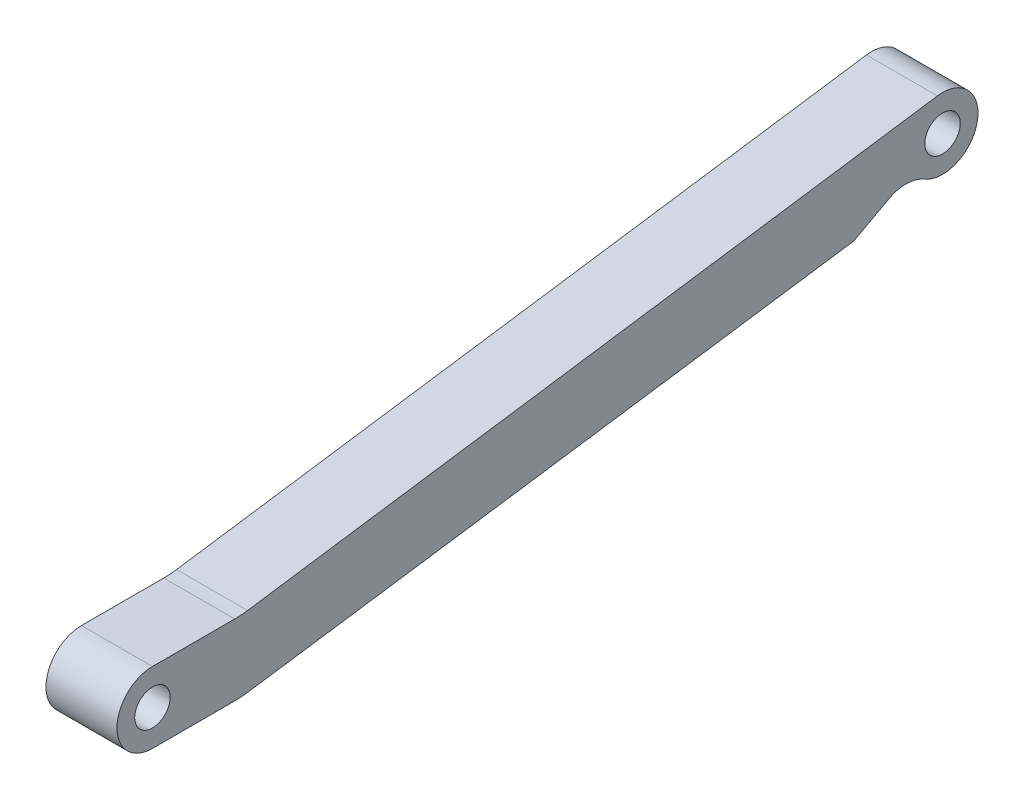
ISO-10303-21;
HEADER;
FILE_DESCRIPTION(('STEP AP214'),'2;1');
FILE_NAME('part.step','',(''),(''),'','','');
FILE_SCHEMA(('AUTOMOTIVE_DESIGN { 1 0 10303 214 1 1 1 1 }'));
ENDSEC;
DATA;
#1=APPLICATION_CONTEXT('core data for automotive mechanical design processes');
#2=APPLICATION_PROTOCOL_DEFINITION('international standard','automotive_design',2000,#1);
#3=PRODUCT_CONTEXT('',#1,'mechanical');
#4=PRODUCT('Part','Part','',(#3));
#5=PRODUCT_RELATED_PRODUCT_CATEGORY('part','',(#4));
#6=PRODUCT_DEFINITION_FORMATION('','',#4);
#7=PRODUCT_DEFINITION_CONTEXT('part definition',#1,'design');
#8=PRODUCT_DEFINITION('design','',#6,#7);
#9=PRODUCT_DEFINITION_SHAPE('','',#8);
#10=(LENGTH_UNIT() NAMED_UNIT(*) SI_UNIT(.MILLI.,.METRE.));
#11=(NAMED_UNIT(*) PLANE_ANGLE_UNIT() SI_UNIT($,.RADIAN.));
#12=(NAMED_UNIT(*) SI_UNIT($,.STERADIAN.) SOLID_ANGLE_UNIT());
#13=UNCERTAINTY_MEASURE_WITH_UNIT(LENGTH_MEASURE(1.E-05),#10,'distance_accuracy_value','');
#14=(GEOMETRIC_REPRESENTATION_CONTEXT(3) GLOBAL_UNCERTAINTY_ASSIGNED_CONTEXT((#13)) GLOBAL_UNIT_ASSIGNED_CONTEXT((#10,
#11,#12)) REPRESENTATION_CONTEXT('',''));
#15=CARTESIAN_POINT('',(0.,0.,0.));
#16=DIRECTION('',(0.,0.,1.));
#17=DIRECTION('',(1.,0.,0.));
#18=AXIS2_PLACEMENT_3D('',#15,#16,#17);
#19=CARTESIAN_POINT('',(-2.,-1.68281133077112,-42.4742149862689));
#20=DIRECTION('',(1.,0.,0.));
#21=DIRECTION('',(0.,0.,-1.));
#22=AXIS2_PLACEMENT_3D('',#19,#20,#21);
#23=CYLINDRICAL_SURFACE('',#22,2.);
#24=DIRECTION('',(1.,0.,0.));
#25=VECTOR('',#24,1.);
#26=CARTESIAN_POINT('',(-2.,0.0335943346144431,-43.5008364315117));
#27=LINE('',#26,#25);
#28=CARTESIAN_POINT('',(-2.,0.0335943346144431,-43.5008364315117));
#29=VERTEX_POINT('',#28);
#30=CARTESIAN_POINT('',(2.,0.0335943346144431,-43.5008364315117));
#31=VERTEX_POINT('',#30);
#32=EDGE_CURVE('E41',#29,#31,#27,.T.);
#33=ORIENTED_EDGE('',*,*,#32,.T.);
#34=CARTESIAN_POINT('',(2.,-1.68281133077112,-42.4742149862689));
#35=DIRECTION('',(1.,0.,0.));
#36=DIRECTION('',(0.,0.,-1.));
#37=AXIS2_PLACEMENT_3D('',#34,#35,#36);
#38=CIRCLE('',#37,2.);
#39=CARTESIAN_POINT('',(2.,0.0790195647686724,-41.5276676311295));
#40=VERTEX_POINT('',#39);
#41=EDGE_CURVE('E118',#31,#40,#38,.T.);
#42=ORIENTED_EDGE('',*,*,#41,.T.);
#43=DIRECTION('',(1.,0.,0.));
#44=VECTOR('',#43,1.);
#45=CARTESIAN_POINT('',(-2.,0.0790195647686724,-41.5276676311295));
#46=LINE('',#45,#44);
#47=CARTESIAN_POINT('',(-2.,0.0790195647686724,-41.5276676311295));
#48=VERTEX_POINT('',#47);
#49=EDGE_CURVE('E11',#48,#40,#46,.T.);
#50=ORIENTED_EDGE('',*,*,#49,.F.);
#51=CARTESIAN_POINT('',(-2.,-1.68281133077112,-42.4742149862689));
#52=DIRECTION('',(1.,0.,0.));
#53=DIRECTION('',(0.,0.,-1.));
#54=AXIS2_PLACEMENT_3D('',#51,#52,#53);
#55=CIRCLE('',#54,2.);
#56=EDGE_CURVE('E54',#29,#48,#55,.T.);
#57=ORIENTED_EDGE('',*,*,#56,.F.);
#58=EDGE_LOOP('',(#33,#42,#50,#57));
#59=FACE_BOUND('',#58,.T.);
#60=ADVANCED_FACE('F38',(#59),#23,.F.);
#61=CARTESIAN_POINT('',(-2.,-17.2521497769474,-9.26875376245219));
#62=DIRECTION('',(0.,-0.880915447769895,-0.473273677569718));
#63=DIRECTION('',(0.,0.473273677569718,-0.880915447769895));
#64=AXIS2_PLACEMENT_3D('',#61,#62,#63);
#65=PLANE('',#64);
#66=ORIENTED_EDGE('',*,*,#49,.T.);
#67=DIRECTION('',(0.,0.473273677569718,-0.880915447769895));
#68=VECTOR('',#67,1.);
#69=CARTESIAN_POINT('',(2.,-17.2521497769474,-9.26875376245219));
#70=LINE('',#69,#68);
#71=CARTESIAN_POINT('',(2.,-0.995597333777485,-39.5274578767545));
#72=VERTEX_POINT('',#71);
#73=EDGE_CURVE('E136',#72,#40,#70,.T.);
#74=ORIENTED_EDGE('',*,*,#73,.F.);
#75=DIRECTION('',(1.,0.,0.));
#76=VECTOR('',#75,1.);
#77=CARTESIAN_POINT('',(-2.,-0.995597333777485,-39.5274578767545));
#78=LINE('',#77,#76);
#79=CARTESIAN_POINT('',(-2.,-0.995597333777485,-39.5274578767545));
#80=VERTEX_POINT('',#79);
#81=EDGE_CURVE('E46',#80,#72,#78,.T.);
#82=ORIENTED_EDGE('',*,*,#81,.F.);
#83=DIRECTION('',(0.,0.473273677569718,-0.880915447769895));
#84=VECTOR('',#83,1.);
#85=CARTESIAN_POINT('',(-2.,-17.2521497769474,-9.26875376245219));
#86=LINE('',#85,#84);
#87=EDGE_CURVE('E184',#80,#48,#86,.T.);
#88=ORIENTED_EDGE('',*,*,#87,.T.);
#89=EDGE_LOOP('',(#66,#74,#82,#88));
#90=FACE_BOUND('',#89,.T.);
#91=ADVANCED_FACE('F233',(#90),#65,.T.);
#92=CARTESIAN_POINT('',(-2.,-6.58633622576093,-0.954622222304602));
#93=DIRECTION('',(0.,-0.989658876840346,-0.143440954720416));
#94=DIRECTION('',(0.,0.143440954720416,-0.989658876840346));
#95=AXIS2_PLACEMENT_3D('',#92,#93,#94);
#96=PLANE('',#95);
#97=ORIENTED_EDGE('',*,*,#81,.T.);
#98=DIRECTION('',(0.,0.143440954720416,-0.989658876840346));
#99=VECTOR('',#98,1.);
#100=CARTESIAN_POINT('',(2.,-6.58633622576093,-0.954622222304602));
#101=LINE('',#100,#99);
#102=CARTESIAN_POINT('',(2.,-5.94829438420173,-5.35673857411912));
#103=VERTEX_POINT('',#102);
#104=EDGE_CURVE('E155',#103,#72,#101,.T.);
#105=ORIENTED_EDGE('',*,*,#104,.F.);
#106=DIRECTION('',(1.,0.,0.));
#107=VECTOR('',#106,1.);
#108=CARTESIAN_POINT('',(-2.,-5.94829438420173,-5.35673857411912));
#109=LINE('',#108,#107);
#110=CARTESIAN_POINT('',(-2.,-5.94829438420173,-5.35673857411912));
#111=VERTEX_POINT('',#110);
#112=EDGE_CURVE('E192',#111,#103,#109,.T.);
#113=ORIENTED_EDGE('',*,*,#112,.F.);
#114=DIRECTION('',(0.,0.143440954720416,-0.989658876840346));
#115=VECTOR('',#114,1.);
#116=CARTESIAN_POINT('',(-2.,-6.58633622576093,-0.954622222304602));
#117=LINE('',#116,#115);
#118=EDGE_CURVE('E182',#111,#80,#117,.T.);
#119=ORIENTED_EDGE('',*,*,#118,.T.);
#120=EDGE_LOOP('',(#97,#105,#113,#119));
#121=FACE_BOUND('',#120,.T.);
#122=ADVANCED_FACE('F231',(#121),#96,.T.);
#123=CARTESIAN_POINT('',(-2.,-1.,-4.63953380051704));
#124=DIRECTION('',(1.,0.,0.));
#125=DIRECTION('',(0.,0.,-1.));
#126=AXIS2_PLACEMENT_3D('',#123,#124,#125);
#127=CYLINDRICAL_SURFACE('',#126,5.);
#128=ORIENTED_EDGE('',*,*,#112,.T.);
#129=CARTESIAN_POINT('',(2.,-1.,-4.63953380051704));
#130=DIRECTION('',(1.,0.,0.));
#131=DIRECTION('',(0.,0.,-1.));
#132=AXIS2_PLACEMENT_3D('',#129,#130,#131);
#133=CIRCLE('',#132,5.);
#134=CARTESIAN_POINT('',(2.,-6.,-4.63953380051704));
#135=VERTEX_POINT('',#134);
#136=EDGE_CURVE('E152',#135,#103,#133,.T.);
#137=ORIENTED_EDGE('',*,*,#136,.F.);
#138=DIRECTION('',(1.,0.,0.));
#139=VECTOR('',#138,1.);
#140=CARTESIAN_POINT('',(-2.,-6.,-4.63953380051704));
#141=LINE('',#140,#139);
#142=CARTESIAN_POINT('',(-2.,-6.,-4.63953380051704));
#143=VERTEX_POINT('',#142);
#144=EDGE_CURVE('E194',#143,#135,#141,.T.);
#145=ORIENTED_EDGE('',*,*,#144,.F.);
#146=CARTESIAN_POINT('',(-2.,-1.,-4.63953380051704));
#147=DIRECTION('',(1.,0.,0.));
#148=DIRECTION('',(0.,0.,-1.));
#149=AXIS2_PLACEMENT_3D('',#146,#147,#148);
#150=CIRCLE('',#149,5.);
#151=EDGE_CURVE('E179',#143,#111,#150,.T.);
#152=ORIENTED_EDGE('',*,*,#151,.T.);
#153=EDGE_LOOP('',(#128,#137,#145,#152));
#154=FACE_BOUND('',#153,.T.);
#155=ADVANCED_FACE('F226',(#154),#127,.T.);
#156=CARTESIAN_POINT('',(-2.,-6.,0.));
#157=DIRECTION('',(0.,-1.,0.));
#158=DIRECTION('',(0.,0.,-1.));
#159=AXIS2_PLACEMENT_3D('',#156,#157,#158);
#160=PLANE('',#159);
#161=ORIENTED_EDGE('',*,*,#144,.T.);
#162=DIRECTION('',(0.,0.,-1.));
#163=VECTOR('',#162,1.);
#164=CARTESIAN_POINT('',(2.,-6.,0.));
#165=LINE('',#164,#163);
#166=CARTESIAN_POINT('',(2.,-6.,0.));
#167=VERTEX_POINT('',#166);
#168=EDGE_CURVE('E149',#167,#135,#165,.T.);
#169=ORIENTED_EDGE('',*,*,#168,.F.);
#170=DIRECTION('',(1.,0.,0.));
#171=VECTOR('',#170,1.);
#172=CARTESIAN_POINT('',(-2.,-6.,0.));
#173=LINE('',#172,#171);
#174=CARTESIAN_POINT('',(-2.,-6.,0.));
#175=VERTEX_POINT('',#174);
#176=EDGE_CURVE('E196',#175,#167,#173,.T.);
#177=ORIENTED_EDGE('',*,*,#176,.F.);
#178=DIRECTION('',(0.,0.,-1.));
#179=VECTOR('',#178,1.);
#180=CARTESIAN_POINT('',(-2.,-6.,0.));
#181=LINE('',#180,#179);
#182=EDGE_CURVE('E176',#175,#143,#181,.T.);
#183=ORIENTED_EDGE('',*,*,#182,.T.);
#184=EDGE_LOOP('',(#161,#169,#177,#183));
#185=FACE_BOUND('',#184,.T.);
#186=ADVANCED_FACE('F222',(#185),#160,.T.);
#187=CARTESIAN_POINT('',(-2.,-4.,0.));
#188=DIRECTION('',(1.,0.,0.));
#189=DIRECTION('',(0.,0.,-1.));
#190=AXIS2_PLACEMENT_3D('',#187,#188,#189);
#191=CYLINDRICAL_SURFACE('',#190,2.);
#192=ORIENTED_EDGE('',*,*,#176,.T.);
#193=CARTESIAN_POINT('',(2.,-4.,0.));
#194=DIRECTION('',(1.,0.,0.));
#195=DIRECTION('',(0.,0.,-1.));
#196=AXIS2_PLACEMENT_3D('',#193,#194,#195);
#197=CIRCLE('',#196,2.);
#198=CARTESIAN_POINT('',(2.,-2.,0.));
#199=VERTEX_POINT('',#198);
#200=EDGE_CURVE('E146',#199,#167,#197,.T.);
#201=ORIENTED_EDGE('',*,*,#200,.F.);
#202=DIRECTION('',(1.,0.,0.));
#203=VECTOR('',#202,1.);
#204=CARTESIAN_POINT('',(-2.,-2.,0.));
#205=LINE('',#204,#203);
#206=CARTESIAN_POINT('',(-2.,-2.,0.));
#207=VERTEX_POINT('',#206);
#208=EDGE_CURVE('E198',#207,#199,#205,.T.);
#209=ORIENTED_EDGE('',*,*,#208,.F.);
#210=CARTESIAN_POINT('',(-2.,-4.,0.));
#211=DIRECTION('',(1.,0.,0.));
#212=DIRECTION('',(0.,0.,-1.));
#213=AXIS2_PLACEMENT_3D('',#210,#211,#212);
#214=CIRCLE('',#213,2.);
#215=EDGE_CURVE('E173',#207,#175,#214,.T.);
#216=ORIENTED_EDGE('',*,*,#215,.T.);
#217=EDGE_LOOP('',(#192,#201,#209,#216));
#218=FACE_BOUND('',#217,.T.);
#219=ADVANCED_FACE('F249',(#218),#191,.T.);
#220=CARTESIAN_POINT('',(-2.,-2.,0.));
#221=DIRECTION('',(0.,-1.,0.));
#222=DIRECTION('',(0.,0.,-1.));
#223=AXIS2_PLACEMENT_3D('',#220,#221,#222);
#224=PLANE('',#223);
#225=ORIENTED_EDGE('',*,*,#208,.T.);
#226=DIRECTION('',(0.,0.,-1.));
#227=VECTOR('',#226,1.);
#228=CARTESIAN_POINT('',(2.,-2.,0.));
#229=LINE('',#228,#227);
#230=CARTESIAN_POINT('',(2.,-2.,-4.63691241312569));
#231=VERTEX_POINT('',#230);
#232=EDGE_CURVE('E143',#199,#231,#229,.T.);
#233=ORIENTED_EDGE('',*,*,#232,.T.);
#234=DIRECTION('',(1.,0.,0.));
#235=VECTOR('',#234,1.);
#236=CARTESIAN_POINT('',(-2.,-2.,-4.63691241312569));
#237=LINE('',#236,#235);
#238=CARTESIAN_POINT('',(-2.,-2.,-4.63691241312569));
#239=VERTEX_POINT('',#238);
#240=EDGE_CURVE('E200',#239,#231,#237,.T.);
#241=ORIENTED_EDGE('',*,*,#240,.F.);
#242=DIRECTION('',(0.,0.,-1.));
#243=VECTOR('',#242,1.);
#244=CARTESIAN_POINT('',(-2.,-2.,0.));
#245=LINE('',#244,#243);
#246=EDGE_CURVE('E171',#207,#239,#245,.T.);
#247=ORIENTED_EDGE('',*,*,#246,.F.);
#248=EDGE_LOOP('',(#225,#233,#241,#247));
#249=FACE_BOUND('',#248,.T.);
#250=ADVANCED_FACE('F215',(#249),#224,.F.);
#251=CARTESIAN_POINT('',(-2.,3.,-4.63691241312569));
#252=DIRECTION('',(1.,0.,0.));
#253=DIRECTION('',(0.,0.,-1.));
#254=AXIS2_PLACEMENT_3D('',#251,#252,#253);
#255=CYLINDRICAL_SURFACE('',#254,5.);
#256=ORIENTED_EDGE('',*,*,#240,.T.);
#257=CARTESIAN_POINT('',(2.,3.,-4.63691241312569));
#258=DIRECTION('',(1.,0.,0.));
#259=DIRECTION('',(0.,0.,-1.));
#260=AXIS2_PLACEMENT_3D('',#257,#258,#259);
#261=CIRCLE('',#260,5.);
#262=CARTESIAN_POINT('',(2.,-1.9475435803418,-5.35927833190828));
#263=VERTEX_POINT('',#262);
#264=EDGE_CURVE('E140',#231,#263,#261,.T.);
#265=ORIENTED_EDGE('',*,*,#264,.T.);
#266=DIRECTION('',(1.,0.,0.));
#267=VECTOR('',#266,1.);
#268=CARTESIAN_POINT('',(-2.,-1.9475435803418,-5.35927833190828));
#269=LINE('',#268,#267);
#270=CARTESIAN_POINT('',(-2.,-1.9475435803418,-5.35927833190828));
#271=VERTEX_POINT('',#270);
#272=EDGE_CURVE('E202',#271,#263,#269,.T.);
#273=ORIENTED_EDGE('',*,*,#272,.F.);
#274=CARTESIAN_POINT('',(-2.,3.,-4.63691241312569));
#275=DIRECTION('',(1.,0.,0.));
#276=DIRECTION('',(0.,0.,-1.));
#277=AXIS2_PLACEMENT_3D('',#274,#275,#276);
#278=CIRCLE('',#277,5.);
#279=EDGE_CURVE('E169',#239,#271,#278,.T.);
#280=ORIENTED_EDGE('',*,*,#279,.F.);
#281=EDGE_LOOP('',(#256,#265,#273,#280));
#282=FACE_BOUND('',#281,.T.);
#283=ADVANCED_FACE('F211',(#282),#255,.F.);
#284=CARTESIAN_POINT('',(-2.,-2.6730423711766,-0.390277453254161));
#285=DIRECTION('',(0.,-0.989508716068361,-0.144473183756517));
#286=DIRECTION('',(0.,0.144473183756517,-0.989508716068361));
#287=AXIS2_PLACEMENT_3D('',#284,#285,#286);
#288=PLANE('',#287);
#289=ORIENTED_EDGE('',*,*,#272,.T.);
#290=DIRECTION('',(0.,0.144473183756517,-0.989508716068361));
#291=VECTOR('',#290,1.);
#292=CARTESIAN_POINT('',(2.,-2.6730423711766,-0.390277453254161));
#293=LINE('',#292,#291);
#294=CARTESIAN_POINT('',(2.,3.72901743213673,-44.2385115092414));
#295=VERTEX_POINT('',#294);
#296=EDGE_CURVE('E130',#263,#295,#293,.T.);
#297=ORIENTED_EDGE('',*,*,#296,.T.);
#298=DIRECTION('',(1.,0.,0.));
#299=VECTOR('',#298,1.);
#300=CARTESIAN_POINT('',(-2.,3.72901743213673,-44.2385115092414));
#301=LINE('',#300,#299);
#302=CARTESIAN_POINT('',(-2.,3.72901743213673,-44.2385115092414));
#303=VERTEX_POINT('',#302);
#304=EDGE_CURVE('E121',#303,#295,#301,.T.);
#305=ORIENTED_EDGE('',*,*,#304,.F.);
#306=DIRECTION('',(0.,0.144473183756517,-0.989508716068361));
#307=VECTOR('',#306,1.);
#308=CARTESIAN_POINT('',(-2.,-2.6730423711766,-0.390277453254161));
#309=LINE('',#308,#307);
#310=EDGE_CURVE('E167',#271,#303,#309,.T.);
#311=ORIENTED_EDGE('',*,*,#310,.F.);
#312=EDGE_LOOP('',(#289,#297,#305,#311));
#313=FACE_BOUND('',#312,.T.);
#314=ADVANCED_FACE('F206',(#313),#288,.F.);
#315=CARTESIAN_POINT('',(-2.,-4.,0.));
#316=DIRECTION('',(1.,0.,0.));
#317=DIRECTION('',(0.,0.,-1.));
#318=AXIS2_PLACEMENT_3D('',#315,#316,#317);
#319=CYLINDRICAL_SURFACE('',#318,1.);
#320=CARTESIAN_POINT('',(-2.,-4.,0.));
#321=DIRECTION('',(1.,0.,0.));
#322=DIRECTION('',(0.,0.,-1.));
#323=AXIS2_PLACEMENT_3D('',#320,#321,#322);
#324=CIRCLE('',#323,1.);
#325=CARTESIAN_POINT('',(-2.,-4.,-0.999999999999951));
#326=VERTEX_POINT('',#325);
#327=EDGE_CURVE('E186',#326,#326,#324,.T.);
#328=ORIENTED_EDGE('',*,*,#327,.F.);
#329=EDGE_LOOP('',(#328));
#330=FACE_BOUND('',#329,.T.);
#331=CARTESIAN_POINT('',(2.,-4.,0.));
#332=DIRECTION('',(1.,0.,0.));
#333=DIRECTION('',(0.,0.,-1.));
#334=AXIS2_PLACEMENT_3D('',#331,#332,#333);
#335=CIRCLE('',#334,1.);
#336=CARTESIAN_POINT('',(2.,-4.,-0.999999999999951));
#337=VERTEX_POINT('',#336);
#338=EDGE_CURVE('E158',#337,#337,#335,.T.);
#339=ORIENTED_EDGE('',*,*,#338,.T.);
#340=EDGE_LOOP('',(#339));
#341=FACE_BOUND('',#340,.T.);
#342=ADVANCED_FACE('F242',(#330,#341),#319,.F.);
#343=CARTESIAN_POINT('',(-2.,1.75,-44.5274578767545));
#344=DIRECTION('',(1.,0.,0.));
#345=DIRECTION('',(0.,0.,-1.));
#346=AXIS2_PLACEMENT_3D('',#343,#344,#345);
#347=CYLINDRICAL_SURFACE('',#346,2.);
#348=ORIENTED_EDGE('',*,*,#304,.T.);
#349=CARTESIAN_POINT('',(2.,1.75,-44.5274578767545));
#350=DIRECTION('',(1.,0.,0.));
#351=DIRECTION('',(0.,0.,-1.));
#352=AXIS2_PLACEMENT_3D('',#349,#350,#351);
#353=CIRCLE('',#352,2.);
#354=EDGE_CURVE('E124',#31,#295,#353,.T.);
#355=ORIENTED_EDGE('',*,*,#354,.F.);
#356=ORIENTED_EDGE('',*,*,#32,.F.);
#357=CARTESIAN_POINT('',(-2.,1.75,-44.5274578767545));
#358=DIRECTION('',(1.,0.,0.));
#359=DIRECTION('',(0.,0.,-1.));
#360=AXIS2_PLACEMENT_3D('',#357,#358,#359);
#361=CIRCLE('',#360,2.);
#362=EDGE_CURVE('E165',#29,#303,#361,.T.);
#363=ORIENTED_EDGE('',*,*,#362,.T.);
#364=EDGE_LOOP('',(#348,#355,#356,#363));
#365=FACE_BOUND('',#364,.T.);
#366=ADVANCED_FACE('F125',(#365),#347,.T.);
#367=CARTESIAN_POINT('',(-2.,1.75,-44.5274578767545));
#368=DIRECTION('',(1.,0.,0.));
#369=DIRECTION('',(0.,0.,-1.));
#370=AXIS2_PLACEMENT_3D('',#367,#368,#369);
#371=CYLINDRICAL_SURFACE('',#370,0.999999999999998);
#372=CARTESIAN_POINT('',(-2.,1.75,-44.5274578767545));
#373=DIRECTION('',(1.,0.,0.));
#374=DIRECTION('',(0.,0.,-1.));
#375=AXIS2_PLACEMENT_3D('',#372,#373,#374);
#376=CIRCLE('',#375,0.999999999999998);
#377=CARTESIAN_POINT('',(-2.,1.75,-45.5274578767545));
#378=VERTEX_POINT('',#377);
#379=EDGE_CURVE('E122',#378,#378,#376,.T.);
#380=ORIENTED_EDGE('',*,*,#379,.F.);
#381=EDGE_LOOP('',(#380));
#382=FACE_BOUND('',#381,.T.);
#383=CARTESIAN_POINT('',(2.,1.75,-44.5274578767545));
#384=DIRECTION('',(1.,0.,0.));
#385=DIRECTION('',(0.,0.,-1.));
#386=AXIS2_PLACEMENT_3D('',#383,#384,#385);
#387=CIRCLE('',#386,0.999999999999998);
#388=CARTESIAN_POINT('',(2.,1.75,-45.5274578767545));
#389=VERTEX_POINT('',#388);
#390=EDGE_CURVE('E161',#389,#389,#387,.T.);
#391=ORIENTED_EDGE('',*,*,#390,.T.);
#392=EDGE_LOOP('',(#391));
#393=FACE_BOUND('',#392,.T.);
#394=ADVANCED_FACE('F258',(#382,#393),#371,.F.);
#395=CARTESIAN_POINT('',(-2.,0.,0.));
#396=DIRECTION('',(1.,0.,0.));
#397=DIRECTION('',(0.,0.,-1.));
#398=AXIS2_PLACEMENT_3D('',#395,#396,#397);
#399=PLANE('',#398);
#400=ORIENTED_EDGE('',*,*,#56,.T.);
#401=ORIENTED_EDGE('',*,*,#87,.F.);
#402=ORIENTED_EDGE('',*,*,#118,.F.);
#403=ORIENTED_EDGE('',*,*,#151,.F.);
#404=ORIENTED_EDGE('',*,*,#182,.F.);
#405=ORIENTED_EDGE('',*,*,#215,.F.);
#406=ORIENTED_EDGE('',*,*,#246,.T.);
#407=ORIENTED_EDGE('',*,*,#279,.T.);
#408=ORIENTED_EDGE('',*,*,#310,.T.);
#409=ORIENTED_EDGE('',*,*,#362,.F.);
#410=EDGE_LOOP('',(#400,#401,#402,#403,#404,#405,#406,#407,#408,#409));
#411=FACE_BOUND('',#410,.T.);
#412=ORIENTED_EDGE('',*,*,#327,.T.);
#413=EDGE_LOOP('',(#412));
#414=FACE_BOUND('',#413,.T.);
#415=ORIENTED_EDGE('',*,*,#379,.T.);
#416=EDGE_LOOP('',(#415));
#417=FACE_BOUND('',#416,.T.);
#418=ADVANCED_FACE('F228',(#411,#414,#417),#399,.F.);
#419=CARTESIAN_POINT('',(2.,0.,0.));
#420=DIRECTION('',(1.,0.,0.));
#421=DIRECTION('',(0.,0.,-1.));
#422=AXIS2_PLACEMENT_3D('',#419,#420,#421);
#423=PLANE('',#422);
#424=ORIENTED_EDGE('',*,*,#41,.F.);
#425=ORIENTED_EDGE('',*,*,#354,.T.);
#426=ORIENTED_EDGE('',*,*,#296,.F.);
#427=ORIENTED_EDGE('',*,*,#264,.F.);
#428=ORIENTED_EDGE('',*,*,#232,.F.);
#429=ORIENTED_EDGE('',*,*,#200,.T.);
#430=ORIENTED_EDGE('',*,*,#168,.T.);
#431=ORIENTED_EDGE('',*,*,#136,.T.);
#432=ORIENTED_EDGE('',*,*,#104,.T.);
#433=ORIENTED_EDGE('',*,*,#73,.T.);
#434=EDGE_LOOP('',(#424,#425,#426,#427,#428,#429,#430,#431,#432,#433));
#435=FACE_BOUND('',#434,.T.);
#436=ORIENTED_EDGE('',*,*,#338,.F.);
#437=EDGE_LOOP('',(#436));
#438=FACE_BOUND('',#437,.T.);
#439=ORIENTED_EDGE('',*,*,#390,.F.);
#440=EDGE_LOOP('',(#439));
#441=FACE_BOUND('',#440,.T.);
#442=ADVANCED_FACE('F133',(#435,#438,#441),#423,.T.);
#443=CLOSED_SHELL('',(#60,#91,#122,#155,#186,#219,#250,#283,#314,#342,#366,#394,#418,#442));
#444=MANIFOLD_SOLID_BREP('B2',#443);
#445=ADVANCED_BREP_SHAPE_REPRESENTATION('',(#18,#444),#14);
#446=SHAPE_DEFINITION_REPRESENTATION(#9,#445);
ENDSEC;
END-ISO-10303-21;
